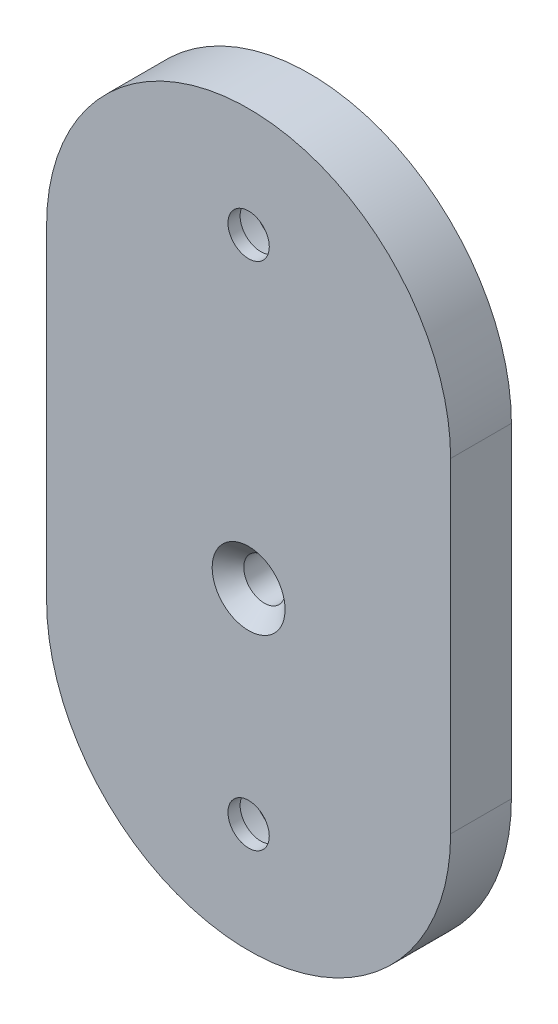
ISO-10303-21;
HEADER;
FILE_DESCRIPTION(('STEP AP214'),'2;1');
FILE_NAME('part.step','',(''),(''),'','','');
FILE_SCHEMA(('AUTOMOTIVE_DESIGN { 1 0 10303 214 1 1 1 1 }'));
ENDSEC;
DATA;
#1=APPLICATION_CONTEXT('core data for automotive mechanical design processes');
#2=APPLICATION_PROTOCOL_DEFINITION('international standard','automotive_design',2000,#1);
#3=PRODUCT_CONTEXT('',#1,'mechanical');
#4=PRODUCT('Part','Part','',(#3));
#5=PRODUCT_RELATED_PRODUCT_CATEGORY('part','',(#4));
#6=PRODUCT_DEFINITION_FORMATION('','',#4);
#7=PRODUCT_DEFINITION_CONTEXT('part definition',#1,'design');
#8=PRODUCT_DEFINITION('design','',#6,#7);
#9=PRODUCT_DEFINITION_SHAPE('','',#8);
#10=(LENGTH_UNIT() NAMED_UNIT(*) SI_UNIT(.MILLI.,.METRE.));
#11=(NAMED_UNIT(*) PLANE_ANGLE_UNIT() SI_UNIT($,.RADIAN.));
#12=(NAMED_UNIT(*) SI_UNIT($,.STERADIAN.) SOLID_ANGLE_UNIT());
#13=UNCERTAINTY_MEASURE_WITH_UNIT(LENGTH_MEASURE(1.E-05),#10,'distance_accuracy_value','');
#14=(GEOMETRIC_REPRESENTATION_CONTEXT(3) GLOBAL_UNCERTAINTY_ASSIGNED_CONTEXT((#13)) GLOBAL_UNIT_ASSIGNED_CONTEXT((#10,
#11,#12)) REPRESENTATION_CONTEXT('',''));
#15=CARTESIAN_POINT('',(0.,0.,0.));
#16=DIRECTION('',(0.,0.,1.));
#17=DIRECTION('',(1.,0.,0.));
#18=AXIS2_PLACEMENT_3D('',#15,#16,#17);
#19=CARTESIAN_POINT('',(0.,-21.,5.));
#20=DIRECTION('',(0.,0.,-1.));
#21=DIRECTION('',(-1.,0.,0.));
#22=AXIS2_PLACEMENT_3D('',#19,#20,#21);
#23=CYLINDRICAL_SURFACE('',#22,1.7);
#24=CARTESIAN_POINT('',(0.,-21.,5.));
#25=DIRECTION('',(0.,0.,1.));
#26=DIRECTION('',(1.,0.,0.));
#27=AXIS2_PLACEMENT_3D('',#24,#25,#26);
#28=CIRCLE('',#27,1.7);
#29=CARTESIAN_POINT('',(1.7,-21.,5.));
#30=VERTEX_POINT('',#29);
#31=EDGE_CURVE('E108',#30,#30,#28,.T.);
#32=ORIENTED_EDGE('',*,*,#31,.T.);
#33=EDGE_LOOP('',(#32));
#34=FACE_BOUND('',#33,.T.);
#35=CARTESIAN_POINT('',(0.,-21.,4.));
#36=DIRECTION('',(0.,0.,-1.));
#37=DIRECTION('',(-1.,0.,0.));
#38=AXIS2_PLACEMENT_3D('',#35,#36,#37);
#39=CIRCLE('',#38,1.7);
#40=CARTESIAN_POINT('',(-1.7,-21.,4.));
#41=VERTEX_POINT('',#40);
#42=EDGE_CURVE('E119',#41,#41,#39,.T.);
#43=ORIENTED_EDGE('',*,*,#42,.T.);
#44=EDGE_LOOP('',(#43));
#45=FACE_BOUND('',#44,.T.);
#46=ADVANCED_FACE('F35',(#34,#45),#23,.F.);
#47=CARTESIAN_POINT('',(0.,21.,5.));
#48=DIRECTION('',(0.,0.,-1.));
#49=DIRECTION('',(-1.,0.,0.));
#50=AXIS2_PLACEMENT_3D('',#47,#48,#49);
#51=CYLINDRICAL_SURFACE('',#50,1.7);
#52=CARTESIAN_POINT('',(0.,21.,5.));
#53=DIRECTION('',(0.,0.,1.));
#54=DIRECTION('',(1.,0.,0.));
#55=AXIS2_PLACEMENT_3D('',#52,#53,#54);
#56=CIRCLE('',#55,1.7);
#57=CARTESIAN_POINT('',(1.69999999999999,21.,5.));
#58=VERTEX_POINT('',#57);
#59=EDGE_CURVE('E161',#58,#58,#56,.T.);
#60=ORIENTED_EDGE('',*,*,#59,.T.);
#61=EDGE_LOOP('',(#60));
#62=FACE_BOUND('',#61,.T.);
#63=CARTESIAN_POINT('',(0.,21.,4.));
#64=DIRECTION('',(0.,0.,-1.));
#65=DIRECTION('',(-1.,0.,0.));
#66=AXIS2_PLACEMENT_3D('',#63,#64,#65);
#67=CIRCLE('',#66,1.7);
#68=CARTESIAN_POINT('',(-1.70000000000001,21.,4.));
#69=VERTEX_POINT('',#68);
#70=EDGE_CURVE('E116',#69,#69,#67,.T.);
#71=ORIENTED_EDGE('',*,*,#70,.T.);
#72=EDGE_LOOP('',(#71));
#73=FACE_BOUND('',#72,.T.);
#74=ADVANCED_FACE('F170',(#62,#73),#51,.F.);
#75=CARTESIAN_POINT('',(0.,-13.377,5.));
#76=DIRECTION('',(0.,0.,-1.));
#77=DIRECTION('',(-1.,0.,0.));
#78=AXIS2_PLACEMENT_3D('',#75,#76,#77);
#79=PLANE('',#78);
#80=CARTESIAN_POINT('',(0.,-4.2,5.));
#81=DIRECTION('',(0.,0.,-1.));
#82=DIRECTION('',(0.,1.,0.));
#83=AXIS2_PLACEMENT_3D('',#80,#81,#82);
#84=CIRCLE('',#83,3.);
#85=CARTESIAN_POINT('',(0.,-1.2,5.));
#86=VERTEX_POINT('',#85);
#87=EDGE_CURVE('E158',#86,#86,#84,.T.);
#88=ORIENTED_EDGE('',*,*,#87,.T.);
#89=EDGE_LOOP('',(#88));
#90=FACE_BOUND('',#89,.T.);
#91=CARTESIAN_POINT('',(0.,-13.377,5.));
#92=DIRECTION('',(0.,0.,1.));
#93=DIRECTION('',(-1.,0.,0.));
#94=AXIS2_PLACEMENT_3D('',#91,#92,#93);
#95=CIRCLE('',#94,16.6225);
#96=CARTESIAN_POINT('',(-16.6225,-13.377,5.));
#97=VERTEX_POINT('',#96);
#98=CARTESIAN_POINT('',(16.6225,-13.377,5.));
#99=VERTEX_POINT('',#98);
#100=EDGE_CURVE('E90',#97,#99,#95,.T.);
#101=ORIENTED_EDGE('',*,*,#100,.T.);
#102=DIRECTION('',(0.,1.,0.));
#103=VECTOR('',#102,1.);
#104=CARTESIAN_POINT('',(16.6225,13.377,5.));
#105=LINE('',#104,#103);
#106=CARTESIAN_POINT('',(16.6225,13.377,5.));
#107=VERTEX_POINT('',#106);
#108=EDGE_CURVE('E84',#99,#107,#105,.T.);
#109=ORIENTED_EDGE('',*,*,#108,.T.);
#110=CARTESIAN_POINT('',(0.,13.377,5.));
#111=DIRECTION('',(0.,0.,1.));
#112=DIRECTION('',(-1.,0.,0.));
#113=AXIS2_PLACEMENT_3D('',#110,#111,#112);
#114=CIRCLE('',#113,16.6225);
#115=CARTESIAN_POINT('',(-16.6225,13.377,5.));
#116=VERTEX_POINT('',#115);
#117=EDGE_CURVE('E88',#107,#116,#114,.T.);
#118=ORIENTED_EDGE('',*,*,#117,.T.);
#119=DIRECTION('',(0.,-1.,0.));
#120=VECTOR('',#119,1.);
#121=CARTESIAN_POINT('',(-16.6225,-13.377,5.));
#122=LINE('',#121,#120);
#123=EDGE_CURVE('E53',#116,#97,#122,.T.);
#124=ORIENTED_EDGE('',*,*,#123,.T.);
#125=EDGE_LOOP('',(#101,#109,#118,#124));
#126=FACE_BOUND('',#125,.T.);
#127=ORIENTED_EDGE('',*,*,#31,.F.);
#128=EDGE_LOOP('',(#127));
#129=FACE_BOUND('',#128,.T.);
#130=ORIENTED_EDGE('',*,*,#59,.F.);
#131=EDGE_LOOP('',(#130));
#132=FACE_BOUND('',#131,.T.);
#133=ADVANCED_FACE('F85',(#90,#126,#129,#132),#79,.F.);
#134=CARTESIAN_POINT('',(0.,-13.377,0.));
#135=DIRECTION('',(0.,0.,-1.));
#136=DIRECTION('',(-1.,0.,0.));
#137=AXIS2_PLACEMENT_3D('',#134,#135,#136);
#138=PLANE('',#137);
#139=CARTESIAN_POINT('',(0.,-21.,0.));
#140=DIRECTION('',(0.,0.,-1.));
#141=DIRECTION('',(-1.,0.,0.));
#142=AXIS2_PLACEMENT_3D('',#139,#140,#141);
#143=CIRCLE('',#142,5.3);
#144=CARTESIAN_POINT('',(-5.29999999999999,-21.,0.));
#145=VERTEX_POINT('',#144);
#146=EDGE_CURVE('E45',#145,#145,#143,.F.);
#147=ORIENTED_EDGE('',*,*,#146,.T.);
#148=EDGE_LOOP('',(#147));
#149=FACE_BOUND('',#148,.T.);
#150=CARTESIAN_POINT('',(0.,21.,0.));
#151=DIRECTION('',(0.,0.,-1.));
#152=DIRECTION('',(-1.,0.,0.));
#153=AXIS2_PLACEMENT_3D('',#150,#151,#152);
#154=CIRCLE('',#153,5.3);
#155=CARTESIAN_POINT('',(-5.30000000000001,21.,0.));
#156=VERTEX_POINT('',#155);
#157=EDGE_CURVE('E126',#156,#156,#154,.F.);
#158=ORIENTED_EDGE('',*,*,#157,.T.);
#159=EDGE_LOOP('',(#158));
#160=FACE_BOUND('',#159,.T.);
#161=CARTESIAN_POINT('',(0.,-4.2,0.));
#162=DIRECTION('',(0.,0.,-1.));
#163=DIRECTION('',(0.,1.,0.));
#164=AXIS2_PLACEMENT_3D('',#161,#162,#163);
#165=CIRCLE('',#164,1.7);
#166=CARTESIAN_POINT('',(0.,-2.5,0.));
#167=VERTEX_POINT('',#166);
#168=EDGE_CURVE('E123',#167,#167,#165,.T.);
#169=ORIENTED_EDGE('',*,*,#168,.F.);
#170=EDGE_LOOP('',(#169));
#171=FACE_BOUND('',#170,.T.);
#172=CARTESIAN_POINT('',(0.,-13.377,0.));
#173=DIRECTION('',(0.,0.,1.));
#174=DIRECTION('',(-1.,0.,0.));
#175=AXIS2_PLACEMENT_3D('',#172,#173,#174);
#176=CIRCLE('',#175,16.6225);
#177=CARTESIAN_POINT('',(-16.6225,-13.377,0.));
#178=VERTEX_POINT('',#177);
#179=CARTESIAN_POINT('',(16.6225,-13.377,0.));
#180=VERTEX_POINT('',#179);
#181=EDGE_CURVE('E105',#178,#180,#176,.T.);
#182=ORIENTED_EDGE('',*,*,#181,.F.);
#183=DIRECTION('',(0.,-1.,0.));
#184=VECTOR('',#183,1.);
#185=CARTESIAN_POINT('',(-16.6225,-13.377,0.));
#186=LINE('',#185,#184);
#187=CARTESIAN_POINT('',(-16.6225,13.377,0.));
#188=VERTEX_POINT('',#187);
#189=EDGE_CURVE('E76',#188,#178,#186,.T.);
#190=ORIENTED_EDGE('',*,*,#189,.F.);
#191=CARTESIAN_POINT('',(0.,13.377,0.));
#192=DIRECTION('',(0.,0.,1.));
#193=DIRECTION('',(-1.,0.,0.));
#194=AXIS2_PLACEMENT_3D('',#191,#192,#193);
#195=CIRCLE('',#194,16.6225);
#196=CARTESIAN_POINT('',(16.6225,13.377,0.));
#197=VERTEX_POINT('',#196);
#198=EDGE_CURVE('E70',#197,#188,#195,.T.);
#199=ORIENTED_EDGE('',*,*,#198,.F.);
#200=DIRECTION('',(0.,1.,0.));
#201=VECTOR('',#200,1.);
#202=CARTESIAN_POINT('',(16.6225,13.377,0.));
#203=LINE('',#202,#201);
#204=EDGE_CURVE('E95',#180,#197,#203,.T.);
#205=ORIENTED_EDGE('',*,*,#204,.F.);
#206=EDGE_LOOP('',(#182,#190,#199,#205));
#207=FACE_BOUND('',#206,.T.);
#208=ADVANCED_FACE('F131',(#149,#160,#171,#207),#138,.T.);
#209=CARTESIAN_POINT('',(0.,-13.377,5.));
#210=DIRECTION('',(0.,0.,-1.));
#211=DIRECTION('',(-1.,0.,0.));
#212=AXIS2_PLACEMENT_3D('',#209,#210,#211);
#213=CYLINDRICAL_SURFACE('',#212,16.6225);
#214=ORIENTED_EDGE('',*,*,#181,.T.);
#215=DIRECTION('',(0.,0.,-1.));
#216=VECTOR('',#215,1.);
#217=CARTESIAN_POINT('',(16.6225,-13.377,5.));
#218=LINE('',#217,#216);
#219=EDGE_CURVE('E96',#99,#180,#218,.T.);
#220=ORIENTED_EDGE('',*,*,#219,.F.);
#221=ORIENTED_EDGE('',*,*,#100,.F.);
#222=DIRECTION('',(0.,0.,-1.));
#223=VECTOR('',#222,1.);
#224=CARTESIAN_POINT('',(-16.6225,-13.377,5.));
#225=LINE('',#224,#223);
#226=EDGE_CURVE('E101',#97,#178,#225,.T.);
#227=ORIENTED_EDGE('',*,*,#226,.T.);
#228=EDGE_LOOP('',(#214,#220,#221,#227));
#229=FACE_BOUND('',#228,.T.);
#230=ADVANCED_FACE('F205',(#229),#213,.T.);
#231=CARTESIAN_POINT('',(16.6225,13.377,5.));
#232=DIRECTION('',(-1.,0.,0.));
#233=DIRECTION('',(0.,-1.,0.));
#234=AXIS2_PLACEMENT_3D('',#231,#232,#233);
#235=PLANE('',#234);
#236=ORIENTED_EDGE('',*,*,#204,.T.);
#237=DIRECTION('',(0.,0.,-1.));
#238=VECTOR('',#237,1.);
#239=CARTESIAN_POINT('',(16.6225,13.377,5.));
#240=LINE('',#239,#238);
#241=EDGE_CURVE('E93',#107,#197,#240,.T.);
#242=ORIENTED_EDGE('',*,*,#241,.F.);
#243=ORIENTED_EDGE('',*,*,#108,.F.);
#244=ORIENTED_EDGE('',*,*,#219,.T.);
#245=EDGE_LOOP('',(#236,#242,#243,#244));
#246=FACE_BOUND('',#245,.T.);
#247=ADVANCED_FACE('F94',(#246),#235,.F.);
#248=CARTESIAN_POINT('',(0.,13.377,5.));
#249=DIRECTION('',(0.,0.,-1.));
#250=DIRECTION('',(-1.,0.,0.));
#251=AXIS2_PLACEMENT_3D('',#248,#249,#250);
#252=CYLINDRICAL_SURFACE('',#251,16.6225);
#253=ORIENTED_EDGE('',*,*,#198,.T.);
#254=DIRECTION('',(0.,0.,-1.));
#255=VECTOR('',#254,1.);
#256=CARTESIAN_POINT('',(-16.6225,13.377,5.));
#257=LINE('',#256,#255);
#258=EDGE_CURVE('E97',#116,#188,#257,.T.);
#259=ORIENTED_EDGE('',*,*,#258,.F.);
#260=ORIENTED_EDGE('',*,*,#117,.F.);
#261=ORIENTED_EDGE('',*,*,#241,.T.);
#262=EDGE_LOOP('',(#253,#259,#260,#261));
#263=FACE_BOUND('',#262,.T.);
#264=ADVANCED_FACE('F99',(#263),#252,.T.);
#265=CARTESIAN_POINT('',(-16.6225,-13.377,5.));
#266=DIRECTION('',(1.,0.,0.));
#267=DIRECTION('',(0.,1.,0.));
#268=AXIS2_PLACEMENT_3D('',#265,#266,#267);
#269=PLANE('',#268);
#270=ORIENTED_EDGE('',*,*,#189,.T.);
#271=ORIENTED_EDGE('',*,*,#226,.F.);
#272=ORIENTED_EDGE('',*,*,#123,.F.);
#273=ORIENTED_EDGE('',*,*,#258,.T.);
#274=EDGE_LOOP('',(#270,#271,#272,#273));
#275=FACE_BOUND('',#274,.T.);
#276=ADVANCED_FACE('F206',(#275),#269,.F.);
#277=CARTESIAN_POINT('',(0.,-4.2,5.));
#278=DIRECTION('',(0.,0.,1.));
#279=DIRECTION('',(0.,-1.,0.));
#280=AXIS2_PLACEMENT_3D('',#277,#278,#279);
#281=CONICAL_SURFACE('',#280,3.,0.785398163397443);
#282=CARTESIAN_POINT('',(0.,-4.2,3.69999999999999));
#283=DIRECTION('',(0.,0.,-1.));
#284=DIRECTION('',(0.,1.,0.));
#285=AXIS2_PLACEMENT_3D('',#282,#283,#284);
#286=CIRCLE('',#285,1.7);
#287=CARTESIAN_POINT('',(0.,-2.5,3.69999999999999));
#288=VERTEX_POINT('',#287);
#289=EDGE_CURVE('E155',#288,#288,#286,.T.);
#290=ORIENTED_EDGE('',*,*,#289,.T.);
#291=EDGE_LOOP('',(#290));
#292=FACE_BOUND('',#291,.T.);
#293=ORIENTED_EDGE('',*,*,#87,.F.);
#294=EDGE_LOOP('',(#293));
#295=FACE_BOUND('',#294,.T.);
#296=ADVANCED_FACE('F193',(#292,#295),#281,.F.);
#297=CARTESIAN_POINT('',(0.,-4.2,2.50000000003069));
#298=DIRECTION('',(0.,0.,-1.));
#299=DIRECTION('',(0.,1.,0.));
#300=AXIS2_PLACEMENT_3D('',#297,#298,#299);
#301=CYLINDRICAL_SURFACE('',#300,1.7);
#302=ORIENTED_EDGE('',*,*,#168,.T.);
#303=EDGE_LOOP('',(#302));
#304=FACE_BOUND('',#303,.T.);
#305=ORIENTED_EDGE('',*,*,#289,.F.);
#306=EDGE_LOOP('',(#305));
#307=FACE_BOUND('',#306,.T.);
#308=ADVANCED_FACE('F187',(#304,#307),#301,.F.);
#309=CARTESIAN_POINT('',(0.,21.,4.));
#310=DIRECTION('',(0.,0.,-1.));
#311=DIRECTION('',(-1.,0.,0.));
#312=AXIS2_PLACEMENT_3D('',#309,#310,#311);
#313=CYLINDRICAL_SURFACE('',#312,5.);
#314=CARTESIAN_POINT('',(0.,21.,0.299999999999992));
#315=DIRECTION('',(0.,0.,-1.));
#316=DIRECTION('',(-1.,0.,0.));
#317=AXIS2_PLACEMENT_3D('',#314,#315,#316);
#318=CIRCLE('',#317,5.);
#319=CARTESIAN_POINT('',(-5.00000000000001,21.,0.299999999999992));
#320=VERTEX_POINT('',#319);
#321=EDGE_CURVE('E11',#320,#320,#318,.T.);
#322=ORIENTED_EDGE('',*,*,#321,.T.);
#323=EDGE_LOOP('',(#322));
#324=FACE_BOUND('',#323,.T.);
#325=CARTESIAN_POINT('',(0.,21.,4.));
#326=DIRECTION('',(0.,0.,-1.));
#327=DIRECTION('',(-1.,0.,0.));
#328=AXIS2_PLACEMENT_3D('',#325,#326,#327);
#329=CIRCLE('',#328,5.);
#330=CARTESIAN_POINT('',(-5.00000000000001,21.,4.));
#331=VERTEX_POINT('',#330);
#332=EDGE_CURVE('E120',#331,#331,#329,.T.);
#333=ORIENTED_EDGE('',*,*,#332,.F.);
#334=EDGE_LOOP('',(#333));
#335=FACE_BOUND('',#334,.T.);
#336=ADVANCED_FACE('F182',(#324,#335),#313,.F.);
#337=CARTESIAN_POINT('',(0.,21.,4.));
#338=DIRECTION('',(0.,0.,-1.));
#339=DIRECTION('',(-1.,0.,0.));
#340=AXIS2_PLACEMENT_3D('',#337,#338,#339);
#341=PLANE('',#340);
#342=ORIENTED_EDGE('',*,*,#70,.F.);
#343=EDGE_LOOP('',(#342));
#344=FACE_BOUND('',#343,.T.);
#345=ORIENTED_EDGE('',*,*,#332,.T.);
#346=EDGE_LOOP('',(#345));
#347=FACE_BOUND('',#346,.T.);
#348=ADVANCED_FACE('F143',(#344,#347),#341,.T.);
#349=CARTESIAN_POINT('',(0.,-21.,4.));
#350=DIRECTION('',(0.,0.,-1.));
#351=DIRECTION('',(-1.,0.,0.));
#352=AXIS2_PLACEMENT_3D('',#349,#350,#351);
#353=CYLINDRICAL_SURFACE('',#352,5.);
#354=CARTESIAN_POINT('',(0.,-21.,0.299999999999992));
#355=DIRECTION('',(0.,0.,-1.));
#356=DIRECTION('',(-1.,0.,0.));
#357=AXIS2_PLACEMENT_3D('',#354,#355,#356);
#358=CIRCLE('',#357,5.);
#359=CARTESIAN_POINT('',(-5.,-21.,0.299999999999992));
#360=VERTEX_POINT('',#359);
#361=EDGE_CURVE('E115',#360,#360,#358,.T.);
#362=ORIENTED_EDGE('',*,*,#361,.T.);
#363=EDGE_LOOP('',(#362));
#364=FACE_BOUND('',#363,.T.);
#365=CARTESIAN_POINT('',(0.,-21.,4.));
#366=DIRECTION('',(0.,0.,-1.));
#367=DIRECTION('',(-1.,0.,0.));
#368=AXIS2_PLACEMENT_3D('',#365,#366,#367);
#369=CIRCLE('',#368,5.);
#370=CARTESIAN_POINT('',(-5.,-21.,4.));
#371=VERTEX_POINT('',#370);
#372=EDGE_CURVE('E147',#371,#371,#369,.T.);
#373=ORIENTED_EDGE('',*,*,#372,.F.);
#374=EDGE_LOOP('',(#373));
#375=FACE_BOUND('',#374,.T.);
#376=ADVANCED_FACE('F140',(#364,#375),#353,.F.);
#377=CARTESIAN_POINT('',(0.,-21.,4.));
#378=DIRECTION('',(0.,0.,-1.));
#379=DIRECTION('',(-1.,0.,0.));
#380=AXIS2_PLACEMENT_3D('',#377,#378,#379);
#381=PLANE('',#380);
#382=ORIENTED_EDGE('',*,*,#42,.F.);
#383=EDGE_LOOP('',(#382));
#384=FACE_BOUND('',#383,.T.);
#385=ORIENTED_EDGE('',*,*,#372,.T.);
#386=EDGE_LOOP('',(#385));
#387=FACE_BOUND('',#386,.T.);
#388=ADVANCED_FACE('F137',(#384,#387),#381,.T.);
#389=CARTESIAN_POINT('',(0.,-21.,0.299999999999992));
#390=DIRECTION('',(0.,0.,-1.));
#391=DIRECTION('',(-1.,0.,0.));
#392=AXIS2_PLACEMENT_3D('',#389,#390,#391);
#393=CONICAL_SURFACE('',#392,5.,0.785398163397454);
#394=ORIENTED_EDGE('',*,*,#146,.F.);
#395=EDGE_LOOP('',(#394));
#396=FACE_BOUND('',#395,.T.);
#397=ORIENTED_EDGE('',*,*,#361,.F.);
#398=EDGE_LOOP('',(#397));
#399=FACE_BOUND('',#398,.T.);
#400=ADVANCED_FACE('F134',(#396,#399),#393,.F.);
#401=CARTESIAN_POINT('',(0.,21.,0.299999999999992));
#402=DIRECTION('',(0.,0.,-1.));
#403=DIRECTION('',(-1.,0.,0.));
#404=AXIS2_PLACEMENT_3D('',#401,#402,#403);
#405=CONICAL_SURFACE('',#404,5.,0.785398163397454);
#406=ORIENTED_EDGE('',*,*,#157,.F.);
#407=EDGE_LOOP('',(#406));
#408=FACE_BOUND('',#407,.T.);
#409=ORIENTED_EDGE('',*,*,#321,.F.);
#410=EDGE_LOOP('',(#409));
#411=FACE_BOUND('',#410,.T.);
#412=ADVANCED_FACE('F38',(#408,#411),#405,.F.);
#413=CLOSED_SHELL('',(#46,#74,#133,#208,#230,#247,#264,#276,#296,#308,#336,#348,#376,#388,#400,#412));
#414=MANIFOLD_SOLID_BREP('B2',#413);
#415=ADVANCED_BREP_SHAPE_REPRESENTATION('',(#18,#414),#14);
#416=SHAPE_DEFINITION_REPRESENTATION(#9,#415);
ENDSEC;
END-ISO-10303-21;
